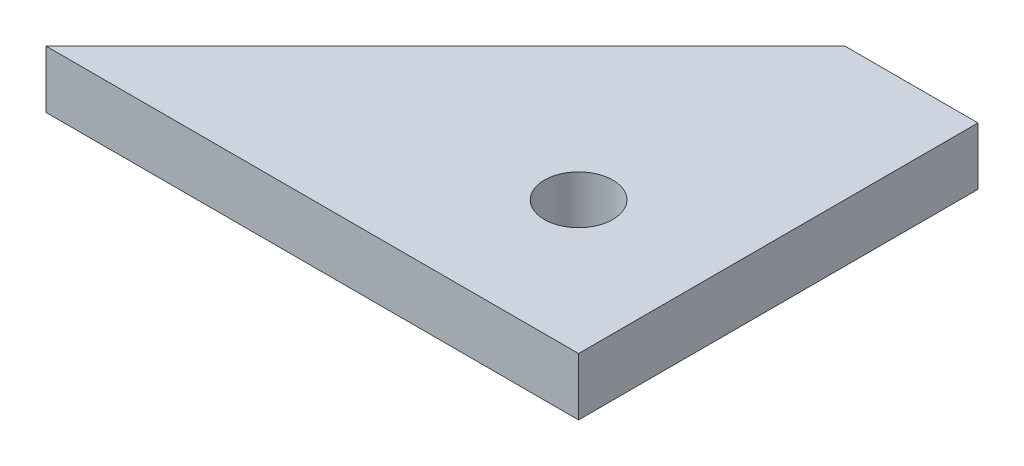
ISO-10303-21;
HEADER;
FILE_DESCRIPTION(('STEP AP214'),'2;1');
FILE_NAME('part.step','',(''),(''),'','','');
FILE_SCHEMA(('AUTOMOTIVE_DESIGN { 1 0 10303 214 1 1 1 1 }'));
ENDSEC;
DATA;
#1=APPLICATION_CONTEXT('core data for automotive mechanical design processes');
#2=APPLICATION_PROTOCOL_DEFINITION('international standard','automotive_design',2000,#1);
#3=PRODUCT_CONTEXT('',#1,'mechanical');
#4=PRODUCT('Part','Part','',(#3));
#5=PRODUCT_RELATED_PRODUCT_CATEGORY('part','',(#4));
#6=PRODUCT_DEFINITION_FORMATION('','',#4);
#7=PRODUCT_DEFINITION_CONTEXT('part definition',#1,'design');
#8=PRODUCT_DEFINITION('design','',#6,#7);
#9=PRODUCT_DEFINITION_SHAPE('','',#8);
#10=(LENGTH_UNIT() NAMED_UNIT(*) SI_UNIT(.MILLI.,.METRE.));
#11=(NAMED_UNIT(*) PLANE_ANGLE_UNIT() SI_UNIT($,.RADIAN.));
#12=(NAMED_UNIT(*) SI_UNIT($,.STERADIAN.) SOLID_ANGLE_UNIT());
#13=UNCERTAINTY_MEASURE_WITH_UNIT(LENGTH_MEASURE(1.E-05),#10,'distance_accuracy_value','');
#14=(GEOMETRIC_REPRESENTATION_CONTEXT(3) GLOBAL_UNCERTAINTY_ASSIGNED_CONTEXT((#13)) GLOBAL_UNIT_ASSIGNED_CONTEXT((#10,
#11,#12)) REPRESENTATION_CONTEXT('',''));
#15=CARTESIAN_POINT('',(0.,0.,0.));
#16=DIRECTION('',(0.,0.,1.));
#17=DIRECTION('',(1.,0.,0.));
#18=AXIS2_PLACEMENT_3D('',#15,#16,#17);
#19=CARTESIAN_POINT('',(0.,2.7432,0.));
#20=DIRECTION('',(0.,1.,0.));
#21=DIRECTION('',(0.,0.,1.));
#22=AXIS2_PLACEMENT_3D('',#19,#20,#21);
#23=PLANE('',#22);
#24=DIRECTION('',(1.,0.,0.));
#25=VECTOR('',#24,1.);
#26=CARTESIAN_POINT('',(0.,2.7432,0.));
#27=LINE('',#26,#25);
#28=CARTESIAN_POINT('',(0.,2.7432,0.));
#29=VERTEX_POINT('',#28);
#30=CARTESIAN_POINT('',(25.4,2.7432,0.));
#31=VERTEX_POINT('',#30);
#32=EDGE_CURVE('E91',#29,#31,#27,.T.);
#33=ORIENTED_EDGE('',*,*,#32,.T.);
#34=DIRECTION('',(0.,0.,-1.));
#35=VECTOR('',#34,1.);
#36=CARTESIAN_POINT('',(25.4,2.7432,0.));
#37=LINE('',#36,#35);
#38=CARTESIAN_POINT('',(25.4,2.7432,-19.05));
#39=VERTEX_POINT('',#38);
#40=EDGE_CURVE('E86',#31,#39,#37,.T.);
#41=ORIENTED_EDGE('',*,*,#40,.T.);
#42=DIRECTION('',(-1.,0.,0.));
#43=VECTOR('',#42,1.);
#44=CARTESIAN_POINT('',(19.05,2.7432,-19.05));
#45=LINE('',#44,#43);
#46=CARTESIAN_POINT('',(19.05,2.7432,-19.05));
#47=VERTEX_POINT('',#46);
#48=EDGE_CURVE('E89',#39,#47,#45,.T.);
#49=ORIENTED_EDGE('',*,*,#48,.T.);
#50=DIRECTION('',(-0.707106781186548,0.,0.707106781186548));
#51=VECTOR('',#50,1.);
#52=CARTESIAN_POINT('',(0.,2.7432,0.));
#53=LINE('',#52,#51);
#54=EDGE_CURVE('E56',#47,#29,#53,.T.);
#55=ORIENTED_EDGE('',*,*,#54,.T.);
#56=EDGE_LOOP('',(#33,#41,#49,#55));
#57=FACE_BOUND('',#56,.T.);
#58=CARTESIAN_POINT('',(19.05,2.7432,-6.35));
#59=DIRECTION('',(0.,1.,0.));
#60=DIRECTION('',(0.,0.,1.));
#61=AXIS2_PLACEMENT_3D('',#58,#59,#60);
#62=CIRCLE('',#61,1.63195);
#63=CARTESIAN_POINT('',(19.05,2.7432,-4.71805));
#64=VERTEX_POINT('',#63);
#65=EDGE_CURVE('E106',#64,#64,#62,.T.);
#66=ORIENTED_EDGE('',*,*,#65,.F.);
#67=EDGE_LOOP('',(#66));
#68=FACE_BOUND('',#67,.T.);
#69=ADVANCED_FACE('F39',(#57,#68),#23,.T.);
#70=CARTESIAN_POINT('',(0.,0.,0.));
#71=DIRECTION('',(0.,1.,0.));
#72=DIRECTION('',(0.,0.,1.));
#73=AXIS2_PLACEMENT_3D('',#70,#71,#72);
#74=PLANE('',#73);
#75=DIRECTION('',(1.,0.,0.));
#76=VECTOR('',#75,1.);
#77=CARTESIAN_POINT('',(0.,0.,0.));
#78=LINE('',#77,#76);
#79=CARTESIAN_POINT('',(0.,0.,0.));
#80=VERTEX_POINT('',#79);
#81=CARTESIAN_POINT('',(25.4,0.,0.));
#82=VERTEX_POINT('',#81);
#83=EDGE_CURVE('E103',#80,#82,#78,.T.);
#84=ORIENTED_EDGE('',*,*,#83,.F.);
#85=DIRECTION('',(-0.707106781186548,0.,0.707106781186548));
#86=VECTOR('',#85,1.);
#87=CARTESIAN_POINT('',(0.,0.,0.));
#88=LINE('',#87,#86);
#89=CARTESIAN_POINT('',(19.05,0.,-19.05));
#90=VERTEX_POINT('',#89);
#91=EDGE_CURVE('E79',#90,#80,#88,.T.);
#92=ORIENTED_EDGE('',*,*,#91,.F.);
#93=DIRECTION('',(-1.,0.,0.));
#94=VECTOR('',#93,1.);
#95=CARTESIAN_POINT('',(19.05,0.,-19.05));
#96=LINE('',#95,#94);
#97=CARTESIAN_POINT('',(25.4,0.,-19.05));
#98=VERTEX_POINT('',#97);
#99=EDGE_CURVE('E73',#98,#90,#96,.T.);
#100=ORIENTED_EDGE('',*,*,#99,.F.);
#101=DIRECTION('',(0.,0.,-1.));
#102=VECTOR('',#101,1.);
#103=CARTESIAN_POINT('',(25.4,0.,0.));
#104=LINE('',#103,#102);
#105=EDGE_CURVE('E95',#82,#98,#104,.T.);
#106=ORIENTED_EDGE('',*,*,#105,.F.);
#107=EDGE_LOOP('',(#84,#92,#100,#106));
#108=FACE_BOUND('',#107,.T.);
#109=CARTESIAN_POINT('',(19.05,0.,-6.35));
#110=DIRECTION('',(0.,1.,0.));
#111=DIRECTION('',(0.,0.,1.));
#112=AXIS2_PLACEMENT_3D('',#109,#110,#111);
#113=CIRCLE('',#112,1.63195);
#114=CARTESIAN_POINT('',(19.05,0.,-4.71805));
#115=VERTEX_POINT('',#114);
#116=EDGE_CURVE('E118',#115,#115,#113,.T.);
#117=ORIENTED_EDGE('',*,*,#116,.T.);
#118=EDGE_LOOP('',(#117));
#119=FACE_BOUND('',#118,.T.);
#120=ADVANCED_FACE('F114',(#108,#119),#74,.F.);
#121=CARTESIAN_POINT('',(0.,2.7432,0.));
#122=DIRECTION('',(0.,0.,-1.));
#123=DIRECTION('',(-1.,0.,0.));
#124=AXIS2_PLACEMENT_3D('',#121,#122,#123);
#125=PLANE('',#124);
#126=ORIENTED_EDGE('',*,*,#83,.T.);
#127=DIRECTION('',(0.,-1.,0.));
#128=VECTOR('',#127,1.);
#129=CARTESIAN_POINT('',(25.4,2.7432,0.));
#130=LINE('',#129,#128);
#131=EDGE_CURVE('E11',#31,#82,#130,.T.);
#132=ORIENTED_EDGE('',*,*,#131,.F.);
#133=ORIENTED_EDGE('',*,*,#32,.F.);
#134=DIRECTION('',(0.,-1.,0.));
#135=VECTOR('',#134,1.);
#136=CARTESIAN_POINT('',(0.,2.7432,0.));
#137=LINE('',#136,#135);
#138=EDGE_CURVE('E99',#29,#80,#137,.T.);
#139=ORIENTED_EDGE('',*,*,#138,.T.);
#140=EDGE_LOOP('',(#126,#132,#133,#139));
#141=FACE_BOUND('',#140,.T.);
#142=ADVANCED_FACE('F41',(#141),#125,.F.);
#143=CARTESIAN_POINT('',(25.4,2.7432,0.));
#144=DIRECTION('',(-1.,0.,0.));
#145=DIRECTION('',(0.,0.,1.));
#146=AXIS2_PLACEMENT_3D('',#143,#144,#145);
#147=PLANE('',#146);
#148=ORIENTED_EDGE('',*,*,#105,.T.);
#149=DIRECTION('',(0.,-1.,0.));
#150=VECTOR('',#149,1.);
#151=CARTESIAN_POINT('',(25.4,2.7432,-19.05));
#152=LINE('',#151,#150);
#153=EDGE_CURVE('E48',#39,#98,#152,.T.);
#154=ORIENTED_EDGE('',*,*,#153,.F.);
#155=ORIENTED_EDGE('',*,*,#40,.F.);
#156=ORIENTED_EDGE('',*,*,#131,.T.);
#157=EDGE_LOOP('',(#148,#154,#155,#156));
#158=FACE_BOUND('',#157,.T.);
#159=ADVANCED_FACE('F94',(#158),#147,.F.);
#160=CARTESIAN_POINT('',(19.05,2.7432,-19.05));
#161=DIRECTION('',(0.,0.,1.));
#162=DIRECTION('',(1.,0.,0.));
#163=AXIS2_PLACEMENT_3D('',#160,#161,#162);
#164=PLANE('',#163);
#165=ORIENTED_EDGE('',*,*,#99,.T.);
#166=DIRECTION('',(0.,-1.,0.));
#167=VECTOR('',#166,1.);
#168=CARTESIAN_POINT('',(19.05,2.7432,-19.05));
#169=LINE('',#168,#167);
#170=EDGE_CURVE('E96',#47,#90,#169,.T.);
#171=ORIENTED_EDGE('',*,*,#170,.F.);
#172=ORIENTED_EDGE('',*,*,#48,.F.);
#173=ORIENTED_EDGE('',*,*,#153,.T.);
#174=EDGE_LOOP('',(#165,#171,#172,#173));
#175=FACE_BOUND('',#174,.T.);
#176=ADVANCED_FACE('F97',(#175),#164,.F.);
#177=CARTESIAN_POINT('',(0.,2.7432,0.));
#178=DIRECTION('',(0.707106781186548,0.,0.707106781186547));
#179=DIRECTION('',(0.707106781186547,0.,-0.707106781186548));
#180=AXIS2_PLACEMENT_3D('',#177,#178,#179);
#181=PLANE('',#180);
#182=ORIENTED_EDGE('',*,*,#91,.T.);
#183=ORIENTED_EDGE('',*,*,#138,.F.);
#184=ORIENTED_EDGE('',*,*,#54,.F.);
#185=ORIENTED_EDGE('',*,*,#170,.T.);
#186=EDGE_LOOP('',(#182,#183,#184,#185));
#187=FACE_BOUND('',#186,.T.);
#188=ADVANCED_FACE('F111',(#187),#181,.F.);
#189=CARTESIAN_POINT('',(19.05,2.7432,-6.35));
#190=DIRECTION('',(0.,-1.,0.));
#191=DIRECTION('',(0.,0.,-1.));
#192=AXIS2_PLACEMENT_3D('',#189,#190,#191);
#193=CYLINDRICAL_SURFACE('',#192,1.63195);
#194=ORIENTED_EDGE('',*,*,#65,.T.);
#195=EDGE_LOOP('',(#194));
#196=FACE_BOUND('',#195,.T.);
#197=ORIENTED_EDGE('',*,*,#116,.F.);
#198=EDGE_LOOP('',(#197));
#199=FACE_BOUND('',#198,.T.);
#200=ADVANCED_FACE('F124',(#196,#199),#193,.F.);
#201=CLOSED_SHELL('',(#69,#120,#142,#159,#176,#188,#200));
#202=MANIFOLD_SOLID_BREP('B2',#201);
#203=ADVANCED_BREP_SHAPE_REPRESENTATION('',(#18,#202),#14);
#204=SHAPE_DEFINITION_REPRESENTATION(#9,#203);
ENDSEC;
END-ISO-10303-21;
